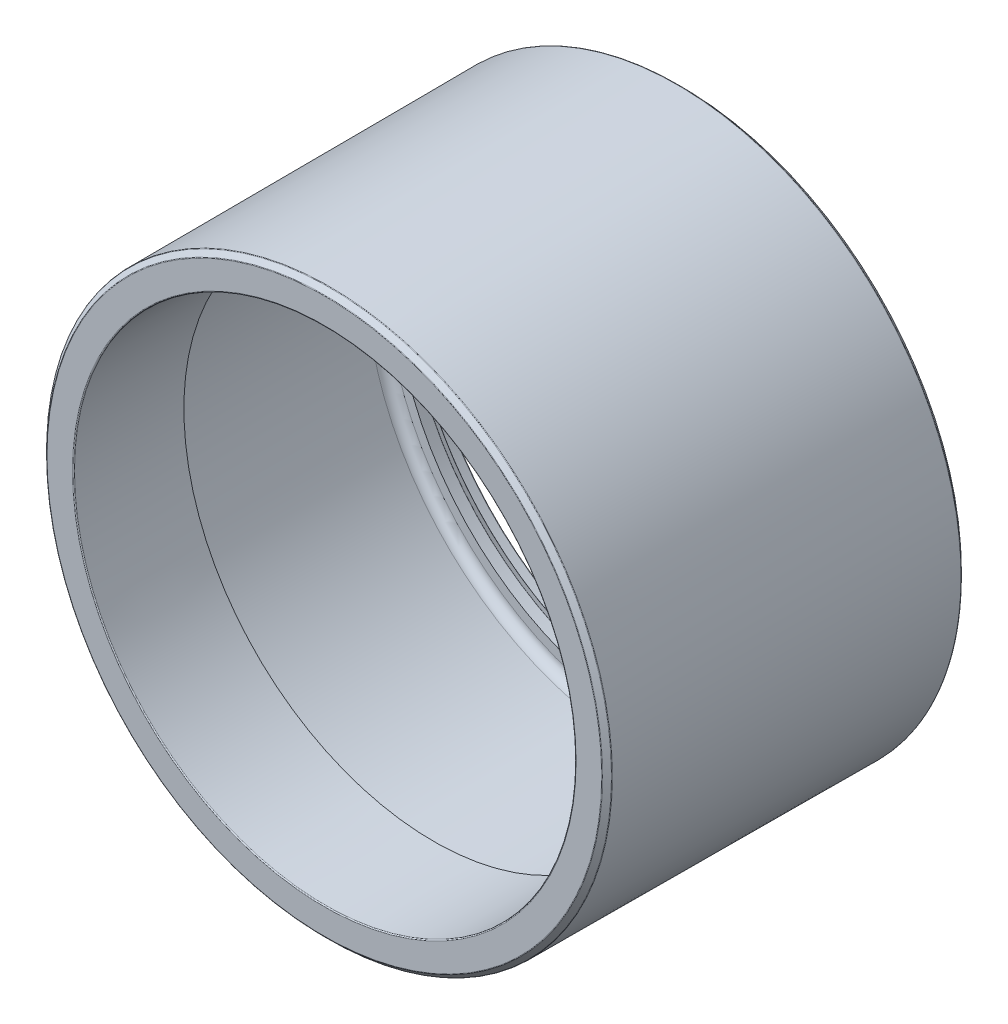
ISO-10303-21;
HEADER;
FILE_DESCRIPTION(('STEP AP214'),'2;1');
FILE_NAME('part.step','',(''),(''),'','','');
FILE_SCHEMA(('AUTOMOTIVE_DESIGN { 1 0 10303 214 1 1 1 1 }'));
ENDSEC;
DATA;
#1=APPLICATION_CONTEXT('core data for automotive mechanical design processes');
#2=APPLICATION_PROTOCOL_DEFINITION('international standard','automotive_design',2000,#1);
#3=PRODUCT_CONTEXT('',#1,'mechanical');
#4=PRODUCT('Part','Part','',(#3));
#5=PRODUCT_RELATED_PRODUCT_CATEGORY('part','',(#4));
#6=PRODUCT_DEFINITION_FORMATION('','',#4);
#7=PRODUCT_DEFINITION_CONTEXT('part definition',#1,'design');
#8=PRODUCT_DEFINITION('design','',#6,#7);
#9=PRODUCT_DEFINITION_SHAPE('','',#8);
#10=(LENGTH_UNIT() NAMED_UNIT(*) SI_UNIT(.MILLI.,.METRE.));
#11=(NAMED_UNIT(*) PLANE_ANGLE_UNIT() SI_UNIT($,.RADIAN.));
#12=(NAMED_UNIT(*) SI_UNIT($,.STERADIAN.) SOLID_ANGLE_UNIT());
#13=UNCERTAINTY_MEASURE_WITH_UNIT(LENGTH_MEASURE(1.E-05),#10,'distance_accuracy_value','');
#14=(GEOMETRIC_REPRESENTATION_CONTEXT(3) GLOBAL_UNCERTAINTY_ASSIGNED_CONTEXT((#13)) GLOBAL_UNIT_ASSIGNED_CONTEXT((#10,
#11,#12)) REPRESENTATION_CONTEXT('',''));
#15=CARTESIAN_POINT('',(0.,0.,0.));
#16=DIRECTION('',(0.,0.,1.));
#17=DIRECTION('',(1.,0.,0.));
#18=AXIS2_PLACEMENT_3D('',#15,#16,#17);
#19=CARTESIAN_POINT('',(0.,0.,6.99999999999997));
#20=DIRECTION('',(0.,0.,1.));
#21=DIRECTION('',(1.,0.,0.));
#22=AXIS2_PLACEMENT_3D('',#19,#20,#21);
#23=CONICAL_SURFACE('',#22,25.125,0.00872664625997167);
#24=CARTESIAN_POINT('',(0.,0.,17.9008726535498));
#25=DIRECTION('',(0.,0.,1.));
#26=DIRECTION('',(1.,0.,0.));
#27=AXIS2_PLACEMENT_3D('',#24,#25,#26);
#28=CIRCLE('',#27,25.2201304744514);
#29=CARTESIAN_POINT('',(25.2201304744514,0.,17.9008726535498));
#30=VERTEX_POINT('',#29);
#31=EDGE_CURVE('E10',#30,#30,#28,.T.);
#32=ORIENTED_EDGE('',*,*,#31,.T.);
#33=EDGE_LOOP('',(#32));
#34=FACE_BOUND('',#33,.T.);
#35=CARTESIAN_POINT('',(0.,0.,6.99999999999997));
#36=DIRECTION('',(0.,0.,1.));
#37=DIRECTION('',(1.,0.,0.));
#38=AXIS2_PLACEMENT_3D('',#35,#36,#37);
#39=CIRCLE('',#38,25.125);
#40=CARTESIAN_POINT('',(25.125,0.,6.99999999999997));
#41=VERTEX_POINT('',#40);
#42=EDGE_CURVE('E143',#41,#41,#39,.T.);
#43=ORIENTED_EDGE('',*,*,#42,.F.);
#44=EDGE_LOOP('',(#43));
#45=FACE_BOUND('',#44,.T.);
#46=ADVANCED_FACE('F47',(#34,#45),#23,.F.);
#47=CARTESIAN_POINT('',(0.,0.,-16.7));
#48=DIRECTION('',(0.,0.,-1.));
#49=DIRECTION('',(-1.,0.,0.));
#50=AXIS2_PLACEMENT_3D('',#47,#48,#49);
#51=CONICAL_SURFACE('',#50,26.0718171694769,1.56206968053493);
#52=CARTESIAN_POINT('',(0.,0.,-16.7005997581683));
#53=DIRECTION('',(0.,0.,1.));
#54=DIRECTION('',(1.,0.,0.));
#55=AXIS2_PLACEMENT_3D('',#52,#53,#54);
#56=CIRCLE('',#55,26.1405426483818);
#57=CARTESIAN_POINT('',(26.1405426483818,0.,-16.7005997581683));
#58=VERTEX_POINT('',#57);
#59=EDGE_CURVE('E60',#58,#58,#56,.T.);
#60=ORIENTED_EDGE('',*,*,#59,.T.);
#61=EDGE_LOOP('',(#60));
#62=FACE_BOUND('',#61,.T.);
#63=CARTESIAN_POINT('',(0.,0.,-16.7027956110617));
#64=DIRECTION('',(0.,0.,1.));
#65=DIRECTION('',(1.,0.,0.));
#66=AXIS2_PLACEMENT_3D('',#63,#64,#65);
#67=CIRCLE('',#66,26.3921624673223);
#68=CARTESIAN_POINT('',(26.3921624673223,0.,-16.7027956110617));
#69=VERTEX_POINT('',#68);
#70=EDGE_CURVE('E119',#69,#69,#67,.T.);
#71=ORIENTED_EDGE('',*,*,#70,.F.);
#72=EDGE_LOOP('',(#71));
#73=FACE_BOUND('',#72,.T.);
#74=ADVANCED_FACE('F178',(#62,#73),#51,.F.);
#75=CARTESIAN_POINT('',(0.,0.,-16.9027879956745));
#76=DIRECTION('',(0.,0.,1.));
#77=DIRECTION('',(1.,0.,0.));
#78=AXIS2_PLACEMENT_3D('',#75,#76,#77);
#79=TOROIDAL_SURFACE('',#78,26.3904171602227,0.2);
#80=CARTESIAN_POINT('',(0.,0.,-16.9010426885748));
#81=DIRECTION('',(0.,0.,1.));
#82=DIRECTION('',(1.,0.,0.));
#83=AXIS2_PLACEMENT_3D('',#80,#81,#82);
#84=CIRCLE('',#83,26.5904095448355);
#85=CARTESIAN_POINT('',(26.5904095448355,0.,-16.9010426885748));
#86=VERTEX_POINT('',#85);
#87=EDGE_CURVE('E124',#86,#86,#84,.T.);
#88=ORIENTED_EDGE('',*,*,#87,.F.);
#89=EDGE_LOOP('',(#88));
#90=FACE_BOUND('',#89,.T.);
#91=ORIENTED_EDGE('',*,*,#70,.T.);
#92=EDGE_LOOP('',(#91));
#93=FACE_BOUND('',#92,.T.);
#94=ADVANCED_FACE('F184',(#90,#93),#79,.F.);
#95=CARTESIAN_POINT('',(0.,0.,-16.9010426885748));
#96=DIRECTION('',(0.,0.,-1.));
#97=DIRECTION('',(-1.,0.,0.));
#98=AXIS2_PLACEMENT_3D('',#95,#96,#97);
#99=CONICAL_SURFACE('',#98,26.5904095448355,0.00872664625998253);
#100=CARTESIAN_POINT('',(0.,0.,-17.9008726535498));
#101=DIRECTION('',(0.,0.,-1.));
#102=DIRECTION('',(-1.,0.,0.));
#103=AXIS2_PLACEMENT_3D('',#100,#101,#102);
#104=CIRCLE('',#103,26.5991349287531);
#105=CARTESIAN_POINT('',(-26.5991349287531,0.,-17.9008726535498));
#106=VERTEX_POINT('',#105);
#107=EDGE_CURVE('E55',#106,#106,#104,.T.);
#108=ORIENTED_EDGE('',*,*,#107,.T.);
#109=EDGE_LOOP('',(#108));
#110=FACE_BOUND('',#109,.T.);
#111=ORIENTED_EDGE('',*,*,#87,.T.);
#112=EDGE_LOOP('',(#111));
#113=FACE_BOUND('',#112,.T.);
#114=ADVANCED_FACE('F240',(#110,#113),#99,.F.);
#115=CARTESIAN_POINT('',(0.,0.,-18.));
#116=DIRECTION('',(0.,0.,-1.));
#117=DIRECTION('',(-1.,0.,0.));
#118=AXIS2_PLACEMENT_3D('',#115,#116,#117);
#119=PLANE('',#118);
#120=CARTESIAN_POINT('',(0.,0.,-18.));
#121=DIRECTION('',(0.,0.,-1.));
#122=DIRECTION('',(-1.,0.,0.));
#123=AXIS2_PLACEMENT_3D('',#120,#121,#122);
#124=CIRCLE('',#123,28.0092428603014);
#125=CARTESIAN_POINT('',(-28.0092428603014,0.,-18.));
#126=VERTEX_POINT('',#125);
#127=EDGE_CURVE('E95',#126,#126,#124,.T.);
#128=ORIENTED_EDGE('',*,*,#127,.T.);
#129=EDGE_LOOP('',(#128));
#130=FACE_BOUND('',#129,.T.);
#131=CARTESIAN_POINT('',(0.,0.,-18.));
#132=DIRECTION('',(0.,0.,-1.));
#133=DIRECTION('',(-1.,0.,0.));
#134=AXIS2_PLACEMENT_3D('',#131,#132,#133);
#135=CIRCLE('',#134,26.6991311210595);
#136=CARTESIAN_POINT('',(-26.6991311210595,0.,-18.));
#137=VERTEX_POINT('',#136);
#138=EDGE_CURVE('E99',#137,#137,#135,.F.);
#139=ORIENTED_EDGE('',*,*,#138,.T.);
#140=EDGE_LOOP('',(#139));
#141=FACE_BOUND('',#140,.T.);
#142=ADVANCED_FACE('F237',(#130,#141),#119,.T.);
#143=CARTESIAN_POINT('',(0.,0.,18.));
#144=DIRECTION('',(0.,0.,-1.));
#145=DIRECTION('',(-1.,0.,0.));
#146=AXIS2_PLACEMENT_3D('',#143,#144,#145);
#147=CONICAL_SURFACE('',#146,28.4250000000012,0.00349065850398888);
#148=CARTESIAN_POINT('',(0.,0.,-17.4601135363162));
#149=DIRECTION('',(0.,0.,1.));
#150=DIRECTION('',(1.,0.,0.));
#151=AXIS2_PLACEMENT_3D('',#148,#149,#150);
#152=CIRCLE('',#151,28.5487796496088);
#153=CARTESIAN_POINT('',(28.5487796496088,0.,-17.4601135363162));
#154=VERTEX_POINT('',#153);
#155=EDGE_CURVE('E111',#154,#154,#152,.T.);
#156=ORIENTED_EDGE('',*,*,#155,.T.);
#157=EDGE_LOOP('',(#156));
#158=FACE_BOUND('',#157,.T.);
#159=CARTESIAN_POINT('',(0.,0.,17.4585819422877));
#160=DIRECTION('',(0.,0.,1.));
#161=DIRECTION('',(1.,0.,0.));
#162=AXIS2_PLACEMENT_3D('',#159,#160,#161);
#163=CIRCLE('',#162,28.4268899132246);
#164=CARTESIAN_POINT('',(28.4268899132246,0.,17.4585819422877));
#165=VERTEX_POINT('',#164);
#166=EDGE_CURVE('E115',#165,#165,#163,.F.);
#167=ORIENTED_EDGE('',*,*,#166,.T.);
#168=EDGE_LOOP('',(#167));
#169=FACE_BOUND('',#168,.T.);
#170=ADVANCED_FACE('F239',(#158,#169),#147,.T.);
#171=CARTESIAN_POINT('',(0.,0.,18.));
#172=DIRECTION('',(0.,0.,1.));
#173=DIRECTION('',(1.,0.,0.));
#174=AXIS2_PLACEMENT_3D('',#171,#172,#173);
#175=PLANE('',#174);
#176=CARTESIAN_POINT('',(0.,0.,18.));
#177=DIRECTION('',(0.,0.,1.));
#178=DIRECTION('',(1.,0.,0.));
#179=AXIS2_PLACEMENT_3D('',#176,#177,#178);
#180=CIRCLE('',#179,27.882028467354);
#181=CARTESIAN_POINT('',(27.882028467354,0.,18.));
#182=VERTEX_POINT('',#181);
#183=EDGE_CURVE('E87',#182,#182,#180,.T.);
#184=ORIENTED_EDGE('',*,*,#183,.T.);
#185=EDGE_LOOP('',(#184));
#186=FACE_BOUND('',#185,.T.);
#187=CARTESIAN_POINT('',(0.,0.,18.));
#188=DIRECTION('',(0.,0.,1.));
#189=DIRECTION('',(1.,0.,0.));
#190=AXIS2_PLACEMENT_3D('',#187,#188,#189);
#191=CIRCLE('',#190,25.3201266667578);
#192=CARTESIAN_POINT('',(25.3201266667578,0.,18.));
#193=VERTEX_POINT('',#192);
#194=EDGE_CURVE('E91',#193,#193,#191,.F.);
#195=ORIENTED_EDGE('',*,*,#194,.T.);
#196=EDGE_LOOP('',(#195));
#197=FACE_BOUND('',#196,.T.);
#198=ADVANCED_FACE('F247',(#186,#197),#175,.T.);
#199=CARTESIAN_POINT('',(0.,0.,-16.1522916021647));
#200=DIRECTION('',(0.,0.,-1.));
#201=DIRECTION('',(-1.,0.,0.));
#202=AXIS2_PLACEMENT_3D('',#199,#200,#201);
#203=CONICAL_SURFACE('',#202,25.8670373907011,0.00872664625998647);
#204=CARTESIAN_POINT('',(0.,0.,-16.134659575493));
#205=DIRECTION('',(0.,0.,-1.));
#206=DIRECTION('',(-1.,0.,0.));
#207=AXIS2_PLACEMENT_3D('',#204,#205,#206);
#208=CIRCLE('',#207,25.8668835183355);
#209=CARTESIAN_POINT('',(-25.8668835183355,0.,-16.134659575493));
#210=VERTEX_POINT('',#209);
#211=EDGE_CURVE('E65',#210,#210,#208,.T.);
#212=ORIENTED_EDGE('',*,*,#211,.T.);
#213=EDGE_LOOP('',(#212));
#214=FACE_BOUND('',#213,.T.);
#215=CARTESIAN_POINT('',(0.,0.,-15.));
#216=DIRECTION('',(0.,0.,-1.));
#217=DIRECTION('',(-1.,0.,0.));
#218=AXIS2_PLACEMENT_3D('',#215,#216,#217);
#219=CIRCLE('',#218,25.8569814942326);
#220=CARTESIAN_POINT('',(-25.8569814942326,0.,-15.));
#221=VERTEX_POINT('',#220);
#222=EDGE_CURVE('E120',#221,#221,#219,.T.);
#223=ORIENTED_EDGE('',*,*,#222,.F.);
#224=EDGE_LOOP('',(#223));
#225=FACE_BOUND('',#224,.T.);
#226=ADVANCED_FACE('F358',(#214,#225),#203,.F.);
#227=CARTESIAN_POINT('',(0.,0.,-16.1522916021647));
#228=DIRECTION('',(0.,0.,-1.));
#229=DIRECTION('',(-1.,0.,0.));
#230=AXIS2_PLACEMENT_3D('',#227,#228,#229);
#231=CONICAL_SURFACE('',#230,25.8670373907011,0.357792496658846);
#232=CARTESIAN_POINT('',(0.,0.,-16.1688076600691));
#233=DIRECTION('',(0.,0.,-1.));
#234=DIRECTION('',(-1.,0.,0.));
#235=AXIS2_PLACEMENT_3D('',#232,#233,#234);
#236=CIRCLE('',#235,25.8732124917171);
#237=CARTESIAN_POINT('',(-25.8732124917171,0.,-16.1688076600691));
#238=VERTEX_POINT('',#237);
#239=EDGE_CURVE('E71',#238,#238,#236,.F.);
#240=ORIENTED_EDGE('',*,*,#239,.T.);
#241=EDGE_LOOP('',(#240));
#242=FACE_BOUND('',#241,.T.);
#243=CARTESIAN_POINT('',(0.,0.,-16.6356243039878));
#244=DIRECTION('',(0.,0.,1.));
#245=DIRECTION('',(1.,0.,0.));
#246=AXIS2_PLACEMENT_3D('',#243,#244,#245);
#247=CIRCLE('',#246,26.0477480830068);
#248=CARTESIAN_POINT('',(26.0477480830068,0.,-16.6356243039878));
#249=VERTEX_POINT('',#248);
#250=EDGE_CURVE('E75',#249,#249,#247,.F.);
#251=ORIENTED_EDGE('',*,*,#250,.T.);
#252=EDGE_LOOP('',(#251));
#253=FACE_BOUND('',#252,.T.);
#254=ADVANCED_FACE('F158',(#242,#253),#231,.F.);
#255=CARTESIAN_POINT('',(0.,0.,-14.));
#256=DIRECTION('',(0.,0.,1.));
#257=DIRECTION('',(1.,0.,0.));
#258=AXIS2_PLACEMENT_3D('',#255,#256,#257);
#259=TOROIDAL_SURFACE('',#258,26.825,1.);
#260=CARTESIAN_POINT('',(0.,0.,-15.));
#261=DIRECTION('',(0.,0.,1.));
#262=DIRECTION('',(1.,0.,0.));
#263=AXIS2_PLACEMENT_3D('',#260,#261,#262);
#264=CIRCLE('',#263,26.825);
#265=CARTESIAN_POINT('',(26.825,0.,-15.));
#266=VERTEX_POINT('',#265);
#267=EDGE_CURVE('E147',#266,#266,#264,.T.);
#268=ORIENTED_EDGE('',*,*,#267,.F.);
#269=EDGE_LOOP('',(#268));
#270=FACE_BOUND('',#269,.T.);
#271=CARTESIAN_POINT('',(0.,0.,-14.));
#272=DIRECTION('',(0.,0.,1.));
#273=DIRECTION('',(1.,0.,0.));
#274=AXIS2_PLACEMENT_3D('',#271,#272,#273);
#275=CIRCLE('',#274,27.825);
#276=CARTESIAN_POINT('',(27.825,0.,-14.));
#277=VERTEX_POINT('',#276);
#278=EDGE_CURVE('E125',#277,#277,#275,.T.);
#279=ORIENTED_EDGE('',*,*,#278,.T.);
#280=EDGE_LOOP('',(#279));
#281=FACE_BOUND('',#280,.T.);
#282=ADVANCED_FACE('F154',(#270,#281),#259,.F.);
#283=CARTESIAN_POINT('',(0.,0.,51.));
#284=DIRECTION('',(0.,0.,1.));
#285=DIRECTION('',(1.,0.,0.));
#286=AXIS2_PLACEMENT_3D('',#283,#284,#285);
#287=CYLINDRICAL_SURFACE('',#286,27.825);
#288=ORIENTED_EDGE('',*,*,#278,.F.);
#289=EDGE_LOOP('',(#288));
#290=FACE_BOUND('',#289,.T.);
#291=CARTESIAN_POINT('',(0.,0.,5.99999999999997));
#292=DIRECTION('',(0.,0.,1.));
#293=DIRECTION('',(1.,0.,0.));
#294=AXIS2_PLACEMENT_3D('',#291,#292,#293);
#295=CIRCLE('',#294,27.825);
#296=CARTESIAN_POINT('',(27.825,0.,5.99999999999997));
#297=VERTEX_POINT('',#296);
#298=EDGE_CURVE('E135',#297,#297,#295,.T.);
#299=ORIENTED_EDGE('',*,*,#298,.T.);
#300=EDGE_LOOP('',(#299));
#301=FACE_BOUND('',#300,.T.);
#302=ADVANCED_FACE('F157',(#290,#301),#287,.F.);
#303=CARTESIAN_POINT('',(0.,0.,5.99999999999997));
#304=DIRECTION('',(0.,0.,1.));
#305=DIRECTION('',(1.,0.,0.));
#306=AXIS2_PLACEMENT_3D('',#303,#304,#305);
#307=TOROIDAL_SURFACE('',#306,26.825,1.);
#308=CARTESIAN_POINT('',(0.,0.,6.99999999999997));
#309=DIRECTION('',(0.,0.,1.));
#310=DIRECTION('',(1.,0.,0.));
#311=AXIS2_PLACEMENT_3D('',#308,#309,#310);
#312=CIRCLE('',#311,26.825);
#313=CARTESIAN_POINT('',(26.825,0.,6.99999999999997));
#314=VERTEX_POINT('',#313);
#315=EDGE_CURVE('E139',#314,#314,#312,.T.);
#316=ORIENTED_EDGE('',*,*,#315,.T.);
#317=EDGE_LOOP('',(#316));
#318=FACE_BOUND('',#317,.T.);
#319=ORIENTED_EDGE('',*,*,#298,.F.);
#320=EDGE_LOOP('',(#319));
#321=FACE_BOUND('',#320,.T.);
#322=ADVANCED_FACE('F164',(#318,#321),#307,.F.);
#323=CARTESIAN_POINT('',(0.,0.,6.99999999999997));
#324=DIRECTION('',(0.,0.,-1.));
#325=DIRECTION('',(-1.,0.,0.));
#326=AXIS2_PLACEMENT_3D('',#323,#324,#325);
#327=PLANE('',#326);
#328=ORIENTED_EDGE('',*,*,#42,.T.);
#329=EDGE_LOOP('',(#328));
#330=FACE_BOUND('',#329,.T.);
#331=ORIENTED_EDGE('',*,*,#315,.F.);
#332=EDGE_LOOP('',(#331));
#333=FACE_BOUND('',#332,.T.);
#334=ADVANCED_FACE('F169',(#330,#333),#327,.T.);
#335=CARTESIAN_POINT('',(0.,0.,-15.));
#336=DIRECTION('',(0.,0.,-1.));
#337=DIRECTION('',(-1.,0.,0.));
#338=AXIS2_PLACEMENT_3D('',#335,#336,#337);
#339=PLANE('',#338);
#340=ORIENTED_EDGE('',*,*,#222,.T.);
#341=EDGE_LOOP('',(#340));
#342=FACE_BOUND('',#341,.T.);
#343=ORIENTED_EDGE('',*,*,#267,.T.);
#344=EDGE_LOOP('',(#343));
#345=FACE_BOUND('',#344,.T.);
#346=ADVANCED_FACE('F152',(#342,#345),#339,.F.);
#347=CARTESIAN_POINT('',(0.,0.,-17.5017392651355));
#348=DIRECTION('',(0.,0.,1.));
#349=DIRECTION('',(1.,0.,0.));
#350=AXIS2_PLACEMENT_3D('',#347,#348,#349);
#351=CONICAL_SURFACE('',#350,28.5489249514032,0.785398163397452);
#352=CARTESIAN_POINT('',(0.,0.,-17.5311732795771));
#353=DIRECTION('',(0.,0.,-1.));
#354=DIRECTION('',(-1.,0.,0.));
#355=AXIS2_PLACEMENT_3D('',#352,#353,#354);
#356=CIRCLE('',#355,28.5194909369616);
#357=CARTESIAN_POINT('',(-28.5194909369616,0.,-17.5311732795771));
#358=VERTEX_POINT('',#357);
#359=EDGE_CURVE('E103',#358,#358,#356,.T.);
#360=ORIENTED_EDGE('',*,*,#359,.T.);
#361=EDGE_LOOP('',(#360));
#362=FACE_BOUND('',#361,.T.);
#363=CARTESIAN_POINT('',(0.,0.,-17.9707106781187));
#364=DIRECTION('',(0.,0.,-1.));
#365=DIRECTION('',(-1.,0.,0.));
#366=AXIS2_PLACEMENT_3D('',#363,#364,#365);
#367=CIRCLE('',#366,28.07995353842);
#368=CARTESIAN_POINT('',(-28.07995353842,0.,-17.9707106781187));
#369=VERTEX_POINT('',#368);
#370=EDGE_CURVE('E107',#369,#369,#367,.F.);
#371=ORIENTED_EDGE('',*,*,#370,.T.);
#372=EDGE_LOOP('',(#371));
#373=FACE_BOUND('',#372,.T.);
#374=ADVANCED_FACE('F191',(#362,#373),#351,.T.);
#375=CARTESIAN_POINT('',(0.,0.,18.));
#376=DIRECTION('',(0.,0.,-1.));
#377=DIRECTION('',(-1.,0.,0.));
#378=AXIS2_PLACEMENT_3D('',#375,#376,#377);
#379=CONICAL_SURFACE('',#378,27.9232454930613,0.788888821901432);
#380=CARTESIAN_POINT('',(0.,0.,17.9709570736537));
#381=DIRECTION('',(0.,0.,1.));
#382=DIRECTION('',(1.,0.,0.));
#383=AXIS2_PLACEMENT_3D('',#380,#381,#382);
#384=CIRCLE('',#383,27.9524918883503);
#385=CARTESIAN_POINT('',(27.9524918883503,0.,17.9709570736537));
#386=VERTEX_POINT('',#385);
#387=EDGE_CURVE('E79',#386,#386,#384,.F.);
#388=ORIENTED_EDGE('',*,*,#387,.T.);
#389=EDGE_LOOP('',(#388));
#390=FACE_BOUND('',#389,.T.);
#391=CARTESIAN_POINT('',(0.,0.,17.529189950799));
#392=DIRECTION('',(0.,0.,1.));
#393=DIRECTION('',(1.,0.,0.));
#394=AXIS2_PLACEMENT_3D('',#391,#392,#393);
#395=CIRCLE('',#394,28.3973539434552);
#396=CARTESIAN_POINT('',(28.3973539434552,0.,17.529189950799));
#397=VERTEX_POINT('',#396);
#398=EDGE_CURVE('E83',#397,#397,#395,.T.);
#399=ORIENTED_EDGE('',*,*,#398,.T.);
#400=EDGE_LOOP('',(#399));
#401=FACE_BOUND('',#400,.T.);
#402=ADVANCED_FACE('F197',(#390,#401),#379,.T.);
#403=CARTESIAN_POINT('',(0.,0.,-17.4604626014584));
#404=DIRECTION('',(0.,0.,-1.));
#405=DIRECTION('',(-1.,0.,0.));
#406=AXIS2_PLACEMENT_3D('',#403,#404,#405);
#407=TOROIDAL_SURFACE('',#406,28.448780258843,0.1);
#408=ORIENTED_EDGE('',*,*,#359,.F.);
#409=EDGE_LOOP('',(#408));
#410=FACE_BOUND('',#409,.T.);
#411=ORIENTED_EDGE('',*,*,#155,.F.);
#412=EDGE_LOOP('',(#411));
#413=FACE_BOUND('',#412,.T.);
#414=ADVANCED_FACE('F203',(#410,#413),#407,.T.);
#415=CARTESIAN_POINT('',(0.,0.,-17.9));
#416=DIRECTION('',(0.,0.,-1.));
#417=DIRECTION('',(-1.,0.,0.));
#418=AXIS2_PLACEMENT_3D('',#415,#416,#417);
#419=TOROIDAL_SURFACE('',#418,28.0092428603014,0.1);
#420=ORIENTED_EDGE('',*,*,#370,.F.);
#421=EDGE_LOOP('',(#420));
#422=FACE_BOUND('',#421,.T.);
#423=ORIENTED_EDGE('',*,*,#127,.F.);
#424=EDGE_LOOP('',(#423));
#425=FACE_BOUND('',#424,.T.);
#426=ADVANCED_FACE('F207',(#422,#425),#419,.T.);
#427=CARTESIAN_POINT('',(0.,0.,17.9));
#428=DIRECTION('',(0.,0.,1.));
#429=DIRECTION('',(1.,0.,0.));
#430=AXIS2_PLACEMENT_3D('',#427,#428,#429);
#431=TOROIDAL_SURFACE('',#430,27.882028467354,0.1);
#432=ORIENTED_EDGE('',*,*,#387,.F.);
#433=EDGE_LOOP('',(#432));
#434=FACE_BOUND('',#433,.T.);
#435=ORIENTED_EDGE('',*,*,#183,.F.);
#436=EDGE_LOOP('',(#435));
#437=FACE_BOUND('',#436,.T.);
#438=ADVANCED_FACE('F211',(#434,#437),#431,.T.);
#439=CARTESIAN_POINT('',(0.,0.,17.4582328771453));
#440=DIRECTION('',(0.,0.,1.));
#441=DIRECTION('',(1.,0.,0.));
#442=AXIS2_PLACEMENT_3D('',#439,#440,#441);
#443=TOROIDAL_SURFACE('',#442,28.3268905224588,0.1);
#444=ORIENTED_EDGE('',*,*,#398,.F.);
#445=EDGE_LOOP('',(#444));
#446=FACE_BOUND('',#445,.T.);
#447=ORIENTED_EDGE('',*,*,#166,.F.);
#448=EDGE_LOOP('',(#447));
#449=FACE_BOUND('',#448,.T.);
#450=ADVANCED_FACE('F215',(#446,#449),#443,.T.);
#451=CARTESIAN_POINT('',(0.,0.,-16.1337869219431));
#452=DIRECTION('',(0.,0.,-1.));
#453=DIRECTION('',(-1.,0.,0.));
#454=AXIS2_PLACEMENT_3D('',#451,#452,#453);
#455=TOROIDAL_SURFACE('',#454,25.9668797106419,0.1);
#456=ORIENTED_EDGE('',*,*,#211,.F.);
#457=EDGE_LOOP('',(#456));
#458=FACE_BOUND('',#457,.T.);
#459=ORIENTED_EDGE('',*,*,#239,.F.);
#460=EDGE_LOOP('',(#459));
#461=FACE_BOUND('',#460,.T.);
#462=ADVANCED_FACE('F219',(#458,#461),#455,.T.);
#463=CARTESIAN_POINT('',(0.,0.,-16.6006035658618));
#464=DIRECTION('',(0.,0.,-1.));
#465=DIRECTION('',(-1.,0.,0.));
#466=AXIS2_PLACEMENT_3D('',#463,#464,#465);
#467=TOROIDAL_SURFACE('',#466,26.1414153019316,0.1);
#468=ORIENTED_EDGE('',*,*,#250,.F.);
#469=EDGE_LOOP('',(#468));
#470=FACE_BOUND('',#469,.T.);
#471=ORIENTED_EDGE('',*,*,#59,.F.);
#472=EDGE_LOOP('',(#471));
#473=FACE_BOUND('',#472,.T.);
#474=ADVANCED_FACE('F223',(#470,#473),#467,.T.);
#475=CARTESIAN_POINT('',(0.,0.,-17.9));
#476=DIRECTION('',(0.,0.,-1.));
#477=DIRECTION('',(-1.,0.,0.));
#478=AXIS2_PLACEMENT_3D('',#475,#476,#477);
#479=TOROIDAL_SURFACE('',#478,26.6991311210595,0.1);
#480=ORIENTED_EDGE('',*,*,#107,.F.);
#481=EDGE_LOOP('',(#480));
#482=FACE_BOUND('',#481,.T.);
#483=ORIENTED_EDGE('',*,*,#138,.F.);
#484=EDGE_LOOP('',(#483));
#485=FACE_BOUND('',#484,.T.);
#486=ADVANCED_FACE('F226',(#482,#485),#479,.T.);
#487=CARTESIAN_POINT('',(0.,0.,17.9));
#488=DIRECTION('',(0.,0.,1.));
#489=DIRECTION('',(1.,0.,0.));
#490=AXIS2_PLACEMENT_3D('',#487,#488,#489);
#491=TOROIDAL_SURFACE('',#490,25.3201266667578,0.1);
#492=ORIENTED_EDGE('',*,*,#194,.F.);
#493=EDGE_LOOP('',(#492));
#494=FACE_BOUND('',#493,.T.);
#495=ORIENTED_EDGE('',*,*,#31,.F.);
#496=EDGE_LOOP('',(#495));
#497=FACE_BOUND('',#496,.T.);
#498=ADVANCED_FACE('F49',(#494,#497),#491,.T.);
#499=CLOSED_SHELL('',(#46,#74,#94,#114,#142,#170,#198,#226,#254,#282,#302,#322,#334,#346,#374,
#402,#414,#426,#438,#450,#462,#474,#486,#498));
#500=MANIFOLD_SOLID_BREP('B2',#499);
#501=ADVANCED_BREP_SHAPE_REPRESENTATION('',(#18,#500),#14);
#502=SHAPE_DEFINITION_REPRESENTATION(#9,#501);
ENDSEC;
END-ISO-10303-21;
